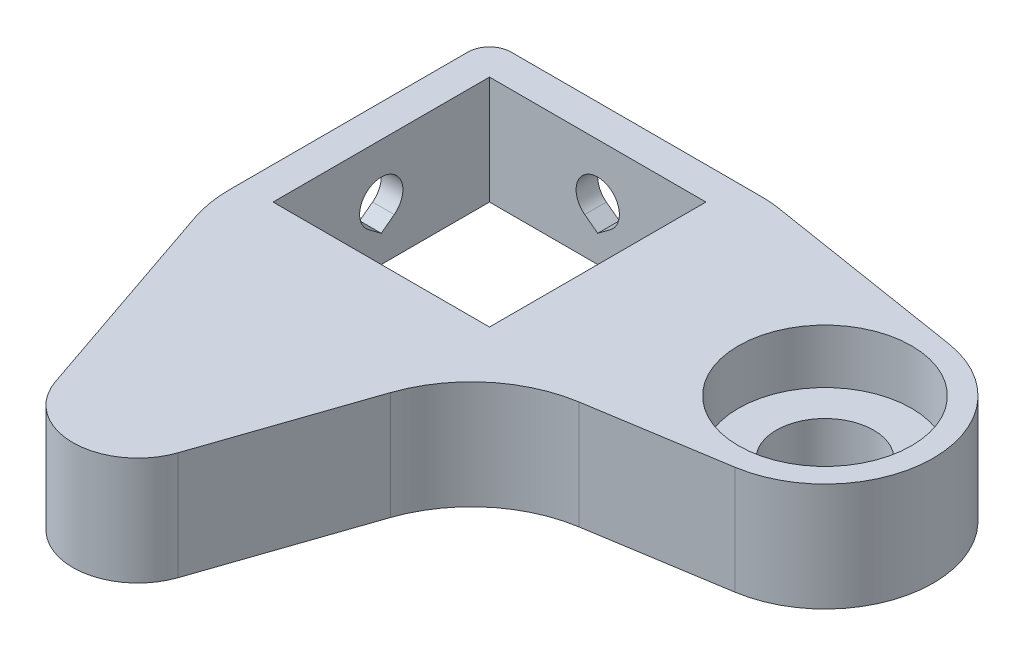
ISO-10303-21;
HEADER;
FILE_DESCRIPTION(('STEP AP214'),'2;1');
FILE_NAME('part.step','',(''),(''),'','','');
FILE_SCHEMA(('AUTOMOTIVE_DESIGN { 1 0 10303 214 1 1 1 1 }'));
ENDSEC;
DATA;
#1=APPLICATION_CONTEXT('core data for automotive mechanical design processes');
#2=APPLICATION_PROTOCOL_DEFINITION('international standard','automotive_design',2000,#1);
#3=PRODUCT_CONTEXT('',#1,'mechanical');
#4=PRODUCT('Part','Part','',(#3));
#5=PRODUCT_RELATED_PRODUCT_CATEGORY('part','',(#4));
#6=PRODUCT_DEFINITION_FORMATION('','',#4);
#7=PRODUCT_DEFINITION_CONTEXT('part definition',#1,'design');
#8=PRODUCT_DEFINITION('design','',#6,#7);
#9=PRODUCT_DEFINITION_SHAPE('','',#8);
#10=(LENGTH_UNIT() NAMED_UNIT(*) SI_UNIT(.MILLI.,.METRE.));
#11=(NAMED_UNIT(*) PLANE_ANGLE_UNIT() SI_UNIT($,.RADIAN.));
#12=(NAMED_UNIT(*) SI_UNIT($,.STERADIAN.) SOLID_ANGLE_UNIT());
#13=UNCERTAINTY_MEASURE_WITH_UNIT(LENGTH_MEASURE(1.E-05),#10,'distance_accuracy_value','');
#14=(GEOMETRIC_REPRESENTATION_CONTEXT(3) GLOBAL_UNCERTAINTY_ASSIGNED_CONTEXT((#13)) GLOBAL_UNIT_ASSIGNED_CONTEXT((#10,
#11,#12)) REPRESENTATION_CONTEXT('',''));
#15=CARTESIAN_POINT('',(0.,0.,0.));
#16=DIRECTION('',(0.,0.,1.));
#17=DIRECTION('',(1.,0.,0.));
#18=AXIS2_PLACEMENT_3D('',#15,#16,#17);
#19=CARTESIAN_POINT('',(-3.,10.,21.0073548304726));
#20=DIRECTION('',(1.,0.,0.));
#21=DIRECTION('',(0.,0.,-1.));
#22=AXIS2_PLACEMENT_3D('',#19,#20,#21);
#23=PLANE('',#22);
#24=DIRECTION('',(0.,0.,1.));
#25=VECTOR('',#24,1.);
#26=CARTESIAN_POINT('',(-3.,0.,21.0073548304726));
#27=LINE('',#26,#25);
#28=CARTESIAN_POINT('',(-3.,0.,-1.));
#29=VERTEX_POINT('',#28);
#30=CARTESIAN_POINT('',(-3.,0.,21.0073548304726));
#31=VERTEX_POINT('',#30);
#32=EDGE_CURVE('E369',#29,#31,#27,.T.);
#33=ORIENTED_EDGE('',*,*,#32,.T.);
#34=DIRECTION('',(0.,-1.,0.));
#35=VECTOR('',#34,1.);
#36=CARTESIAN_POINT('',(-3.,10.,21.0073548304726));
#37=LINE('',#36,#35);
#38=CARTESIAN_POINT('',(-3.,10.,21.0073548304726));
#39=VERTEX_POINT('',#38);
#40=EDGE_CURVE('E55',#39,#31,#37,.T.);
#41=ORIENTED_EDGE('',*,*,#40,.F.);
#42=DIRECTION('',(0.,0.,1.));
#43=VECTOR('',#42,1.);
#44=CARTESIAN_POINT('',(-3.,10.,21.0073548304726));
#45=LINE('',#44,#43);
#46=CARTESIAN_POINT('',(-3.,10.,-1.));
#47=VERTEX_POINT('',#46);
#48=EDGE_CURVE('E331',#47,#39,#45,.T.);
#49=ORIENTED_EDGE('',*,*,#48,.F.);
#50=DIRECTION('',(0.,-1.,0.));
#51=VECTOR('',#50,1.);
#52=CARTESIAN_POINT('',(-3.,10.,-1.));
#53=LINE('',#52,#51);
#54=EDGE_CURVE('E11',#47,#29,#53,.T.);
#55=ORIENTED_EDGE('',*,*,#54,.T.);
#56=EDGE_LOOP('',(#33,#41,#49,#55));
#57=FACE_BOUND('',#56,.T.);
#58=DIRECTION('',(0.,0.62853936105471,-0.777777777777777));
#59=VECTOR('',#58,1.);
#60=CARTESIAN_POINT('',(-3.,0.5,10.));
#61=LINE('',#60,#59);
#62=CARTESIAN_POINT('',(-3.,0.5,10.));
#63=VERTEX_POINT('',#62);
#64=CARTESIAN_POINT('',(-3.,2.27777777777778,7.80011223630853));
#65=VERTEX_POINT('',#64);
#66=EDGE_CURVE('E242',#63,#65,#61,.T.);
#67=ORIENTED_EDGE('',*,*,#66,.T.);
#68=CARTESIAN_POINT('',(-3.,5.,10.));
#69=DIRECTION('',(-1.,0.,0.));
#70=DIRECTION('',(0.,0.,1.));
#71=AXIS2_PLACEMENT_3D('',#68,#69,#70);
#72=CIRCLE('',#71,3.5);
#73=CARTESIAN_POINT('',(-3.,2.27777777777778,12.1998877636915));
#74=VERTEX_POINT('',#73);
#75=EDGE_CURVE('E258',#74,#65,#72,.T.);
#76=ORIENTED_EDGE('',*,*,#75,.F.);
#77=DIRECTION('',(0.,-0.628539361054708,-0.777777777777778));
#78=VECTOR('',#77,1.);
#79=CARTESIAN_POINT('',(-3.,2.27777777777778,12.1998877636915));
#80=LINE('',#79,#78);
#81=EDGE_CURVE('E63',#74,#63,#80,.T.);
#82=ORIENTED_EDGE('',*,*,#81,.T.);
#83=EDGE_LOOP('',(#67,#76,#82));
#84=FACE_BOUND('',#83,.T.);
#85=ADVANCED_FACE('F45',(#57,#84),#23,.F.);
#86=CARTESIAN_POINT('',(-3.,5.,10.));
#87=DIRECTION('',(-1.,0.,0.));
#88=DIRECTION('',(0.,0.,1.));
#89=AXIS2_PLACEMENT_3D('',#86,#87,#88);
#90=CYLINDRICAL_SURFACE('',#89,3.5);
#91=DIRECTION('',(1.,0.,0.));
#92=VECTOR('',#91,1.);
#93=CARTESIAN_POINT('',(-7.74536811201391,2.27777777777778,7.80011223630853));
#94=LINE('',#93,#92);
#95=CARTESIAN_POINT('',(-2.,2.27777777777778,7.80011223630853));
#96=VERTEX_POINT('',#95);
#97=EDGE_CURVE('E243',#65,#96,#94,.T.);
#98=ORIENTED_EDGE('',*,*,#97,.T.);
#99=CARTESIAN_POINT('',(-2.,5.,10.));
#100=DIRECTION('',(-1.,0.,0.));
#101=DIRECTION('',(0.,0.,1.));
#102=AXIS2_PLACEMENT_3D('',#99,#100,#101);
#103=CIRCLE('',#102,3.5);
#104=CARTESIAN_POINT('',(-2.,2.27777777777778,12.1998877636915));
#105=VERTEX_POINT('',#104);
#106=EDGE_CURVE('E250',#105,#96,#103,.T.);
#107=ORIENTED_EDGE('',*,*,#106,.F.);
#108=DIRECTION('',(1.,0.,0.));
#109=VECTOR('',#108,1.);
#110=CARTESIAN_POINT('',(-7.74536811201391,2.27777777777778,12.1998877636915));
#111=LINE('',#110,#109);
#112=EDGE_CURVE('E233',#74,#105,#111,.T.);
#113=ORIENTED_EDGE('',*,*,#112,.F.);
#114=ORIENTED_EDGE('',*,*,#75,.T.);
#115=EDGE_LOOP('',(#98,#107,#113,#114));
#116=FACE_BOUND('',#115,.T.);
#117=ADVANCED_FACE('F255',(#116),#90,.F.);
#118=CARTESIAN_POINT('',(-1.,10.,-3.));
#119=DIRECTION('',(0.,0.,1.));
#120=DIRECTION('',(1.,0.,0.));
#121=AXIS2_PLACEMENT_3D('',#118,#119,#120);
#122=PLANE('',#121);
#123=DIRECTION('',(-1.,0.,0.));
#124=VECTOR('',#123,1.);
#125=CARTESIAN_POINT('',(-1.,0.,-3.));
#126=LINE('',#125,#124);
#127=CARTESIAN_POINT('',(22.0482290774266,0.,-3.));
#128=VERTEX_POINT('',#127);
#129=CARTESIAN_POINT('',(-1.,0.,-3.));
#130=VERTEX_POINT('',#129);
#131=EDGE_CURVE('E332',#128,#130,#126,.T.);
#132=ORIENTED_EDGE('',*,*,#131,.T.);
#133=DIRECTION('',(0.,-1.,0.));
#134=VECTOR('',#133,1.);
#135=CARTESIAN_POINT('',(-1.,10.,-3.));
#136=LINE('',#135,#134);
#137=CARTESIAN_POINT('',(-1.,10.,-3.));
#138=VERTEX_POINT('',#137);
#139=EDGE_CURVE('E365',#138,#130,#136,.T.);
#140=ORIENTED_EDGE('',*,*,#139,.F.);
#141=DIRECTION('',(-1.,0.,0.));
#142=VECTOR('',#141,1.);
#143=CARTESIAN_POINT('',(-1.,10.,-3.));
#144=LINE('',#143,#142);
#145=CARTESIAN_POINT('',(22.0482290774266,10.,-3.));
#146=VERTEX_POINT('',#145);
#147=EDGE_CURVE('E362',#146,#138,#144,.T.);
#148=ORIENTED_EDGE('',*,*,#147,.F.);
#149=DIRECTION('',(0.,-1.,0.));
#150=VECTOR('',#149,1.);
#151=CARTESIAN_POINT('',(22.0482290774266,10.,-3.));
#152=LINE('',#151,#150);
#153=EDGE_CURVE('E404',#146,#128,#152,.T.);
#154=ORIENTED_EDGE('',*,*,#153,.T.);
#155=EDGE_LOOP('',(#132,#140,#148,#154));
#156=FACE_BOUND('',#155,.T.);
#157=DIRECTION('',(0.777777777777777,-0.62853936105471,0.));
#158=VECTOR('',#157,1.);
#159=CARTESIAN_POINT('',(10.,0.5,-3.));
#160=LINE('',#159,#158);
#161=CARTESIAN_POINT('',(7.80011223630852,2.27777777777779,-3.));
#162=VERTEX_POINT('',#161);
#163=CARTESIAN_POINT('',(10.,0.500000000000001,-3.));
#164=VERTEX_POINT('',#163);
#165=EDGE_CURVE('E486',#162,#164,#160,.T.);
#166=ORIENTED_EDGE('',*,*,#165,.T.);
#167=DIRECTION('',(0.777777777777777,0.62853936105471,0.));
#168=VECTOR('',#167,1.);
#169=CARTESIAN_POINT('',(12.1998877636915,2.27777777777778,-3.));
#170=LINE('',#169,#168);
#171=CARTESIAN_POINT('',(12.1998877636915,2.27777777777778,-3.));
#172=VERTEX_POINT('',#171);
#173=EDGE_CURVE('E490',#164,#172,#170,.T.);
#174=ORIENTED_EDGE('',*,*,#173,.T.);
#175=CARTESIAN_POINT('',(10.,5.,-3.));
#176=DIRECTION('',(0.,0.,-1.));
#177=DIRECTION('',(-1.,0.,0.));
#178=AXIS2_PLACEMENT_3D('',#175,#176,#177);
#179=CIRCLE('',#178,3.5);
#180=EDGE_CURVE('E536',#162,#172,#179,.T.);
#181=ORIENTED_EDGE('',*,*,#180,.F.);
#182=EDGE_LOOP('',(#166,#174,#181));
#183=FACE_BOUND('',#182,.T.);
#184=ADVANCED_FACE('F583',(#156,#183),#122,.F.);
#185=CARTESIAN_POINT('',(10.,5.,-3.));
#186=DIRECTION('',(0.,0.,-1.));
#187=DIRECTION('',(-1.,0.,0.));
#188=AXIS2_PLACEMENT_3D('',#185,#186,#187);
#189=CYLINDRICAL_SURFACE('',#188,3.5);
#190=DIRECTION('',(0.,0.,1.));
#191=VECTOR('',#190,1.);
#192=CARTESIAN_POINT('',(7.80011223630852,2.27777777777779,-7.74536811201392));
#193=LINE('',#192,#191);
#194=CARTESIAN_POINT('',(7.80011223630852,2.27777777777779,-2.));
#195=VERTEX_POINT('',#194);
#196=EDGE_CURVE('E507',#162,#195,#193,.T.);
#197=ORIENTED_EDGE('',*,*,#196,.F.);
#198=ORIENTED_EDGE('',*,*,#180,.T.);
#199=DIRECTION('',(0.,0.,1.));
#200=VECTOR('',#199,1.);
#201=CARTESIAN_POINT('',(12.1998877636915,2.27777777777778,-7.74536811201392));
#202=LINE('',#201,#200);
#203=CARTESIAN_POINT('',(12.1998877636915,2.27777777777778,-2.));
#204=VERTEX_POINT('',#203);
#205=EDGE_CURVE('E503',#172,#204,#202,.T.);
#206=ORIENTED_EDGE('',*,*,#205,.T.);
#207=CARTESIAN_POINT('',(10.,5.,-2.));
#208=DIRECTION('',(0.,0.,-1.));
#209=DIRECTION('',(-1.,0.,0.));
#210=AXIS2_PLACEMENT_3D('',#207,#208,#209);
#211=CIRCLE('',#210,3.5);
#212=EDGE_CURVE('E540',#195,#204,#211,.T.);
#213=ORIENTED_EDGE('',*,*,#212,.F.);
#214=EDGE_LOOP('',(#197,#198,#206,#213));
#215=FACE_BOUND('',#214,.T.);
#216=ADVANCED_FACE('F626',(#215),#189,.F.);
#217=CARTESIAN_POINT('',(-1.,10.,-1.));
#218=DIRECTION('',(0.,-1.,0.));
#219=DIRECTION('',(0.,0.,-1.));
#220=AXIS2_PLACEMENT_3D('',#217,#218,#219);
#221=PLANE('',#220);
#222=CARTESIAN_POINT('',(41.,10.,10.));
#223=DIRECTION('',(0.,-1.,0.));
#224=DIRECTION('',(0.,0.,-1.));
#225=AXIS2_PLACEMENT_3D('',#222,#223,#224);
#226=CIRCLE('',#225,8.);
#227=CARTESIAN_POINT('',(41.,10.,2.00000000000001));
#228=VERTEX_POINT('',#227);
#229=EDGE_CURVE('E281',#228,#228,#226,.F.);
#230=ORIENTED_EDGE('',*,*,#229,.F.);
#231=EDGE_LOOP('',(#230));
#232=FACE_BOUND('',#231,.T.);
#233=CARTESIAN_POINT('',(-1.,10.,-1.));
#234=DIRECTION('',(0.,1.,0.));
#235=DIRECTION('',(0.,0.,-1.));
#236=AXIS2_PLACEMENT_3D('',#233,#234,#235);
#237=CIRCLE('',#236,2.);
#238=EDGE_CURVE('E327',#138,#47,#237,.T.);
#239=ORIENTED_EDGE('',*,*,#238,.T.);
#240=ORIENTED_EDGE('',*,*,#48,.T.);
#241=CARTESIAN_POINT('',(9.,10.,21.0073548304726));
#242=DIRECTION('',(0.,1.,0.));
#243=DIRECTION('',(0.,0.,1.));
#244=AXIS2_PLACEMENT_3D('',#241,#242,#243);
#245=CIRCLE('',#244,12.);
#246=CARTESIAN_POINT('',(-2.35598549897115,10.,24.885704137479));
#247=VERTEX_POINT('',#246);
#248=EDGE_CURVE('E335',#39,#247,#245,.T.);
#249=ORIENTED_EDGE('',*,*,#248,.T.);
#250=DIRECTION('',(0.323195775583867,0.,0.946332124914262));
#251=VECTOR('',#250,1.);
#252=CARTESIAN_POINT('',(-2.35598549897114,10.,24.885704137479));
#253=LINE('',#252,#251);
#254=CARTESIAN_POINT('',(4.32200725051444,10.,44.4391746535032));
#255=VERTEX_POINT('',#254);
#256=EDGE_CURVE('E338',#247,#255,#253,.T.);
#257=ORIENTED_EDGE('',*,*,#256,.T.);
#258=CARTESIAN_POINT('',(10.,10.,42.5));
#259=DIRECTION('',(0.,1.,0.));
#260=DIRECTION('',(0.,0.,1.));
#261=AXIS2_PLACEMENT_3D('',#258,#259,#260);
#262=CIRCLE('',#261,6.);
#263=CARTESIAN_POINT('',(15.6779927494856,10.,44.4391746535032));
#264=VERTEX_POINT('',#263);
#265=EDGE_CURVE('E341',#255,#264,#262,.T.);
#266=ORIENTED_EDGE('',*,*,#265,.T.);
#267=DIRECTION('',(0.323195775583867,0.,-0.946332124914262));
#268=VECTOR('',#267,1.);
#269=CARTESIAN_POINT('',(20.6662452592514,10.,29.8333414285865));
#270=LINE('',#269,#268);
#271=CARTESIAN_POINT('',(20.6662452592514,10.,29.8333414285865));
#272=VERTEX_POINT('',#271);
#273=EDGE_CURVE('E344',#264,#272,#270,.T.);
#274=ORIENTED_EDGE('',*,*,#273,.T.);
#275=CARTESIAN_POINT('',(32.0222307582225,10.,33.711690735593));
#276=DIRECTION('',(0.,-1.,0.));
#277=DIRECTION('',(0.,0.,1.));
#278=AXIS2_PLACEMENT_3D('',#275,#276,#277);
#279=CIRCLE('',#278,12.);
#280=CARTESIAN_POINT('',(30.1305887585279,10.,21.8617248898619));
#281=VERTEX_POINT('',#280);
#282=EDGE_CURVE('E347',#272,#281,#279,.T.);
#283=ORIENTED_EDGE('',*,*,#282,.T.);
#284=DIRECTION('',(0.987497153810917,0.,-0.157636833307885));
#285=VECTOR('',#284,1.);
#286=CARTESIAN_POINT('',(30.1305887585279,10.,21.861724889862));
#287=LINE('',#286,#285);
#288=CARTESIAN_POINT('',(42.5763683330788,10.,19.8749715381092));
#289=VERTEX_POINT('',#288);
#290=EDGE_CURVE('E350',#281,#289,#287,.T.);
#291=ORIENTED_EDGE('',*,*,#290,.T.);
#292=CARTESIAN_POINT('',(41.,10.,9.99999999999999));
#293=DIRECTION('',(0.,1.,0.));
#294=DIRECTION('',(0.,0.,1.));
#295=AXIS2_PLACEMENT_3D('',#292,#293,#294);
#296=CIRCLE('',#295,10.);
#297=CARTESIAN_POINT('',(42.5763683330788,10.,0.12502846189082));
#298=VERTEX_POINT('',#297);
#299=EDGE_CURVE('E353',#289,#298,#296,.T.);
#300=ORIENTED_EDGE('',*,*,#299,.T.);
#301=DIRECTION('',(-0.987497153810917,0.,-0.157636833307885));
#302=VECTOR('',#301,1.);
#303=CARTESIAN_POINT('',(23.9398710771213,10.,-2.849965845731));
#304=LINE('',#303,#302);
#305=CARTESIAN_POINT('',(23.9398710771213,10.,-2.849965845731));
#306=VERTEX_POINT('',#305);
#307=EDGE_CURVE('E356',#298,#306,#304,.T.);
#308=ORIENTED_EDGE('',*,*,#307,.T.);
#309=CARTESIAN_POINT('',(22.0482290774266,10.,9.));
#310=DIRECTION('',(0.,1.,0.));
#311=DIRECTION('',(0.,0.,1.));
#312=AXIS2_PLACEMENT_3D('',#309,#310,#311);
#313=CIRCLE('',#312,12.);
#314=EDGE_CURVE('E359',#306,#146,#313,.T.);
#315=ORIENTED_EDGE('',*,*,#314,.T.);
#316=ORIENTED_EDGE('',*,*,#147,.T.);
#317=EDGE_LOOP('',(#239,#240,#249,#257,#266,#274,#283,#291,#300,#308,#315,#316));
#318=FACE_BOUND('',#317,.T.);
#319=DIRECTION('',(0.,0.,-1.));
#320=VECTOR('',#319,1.);
#321=CARTESIAN_POINT('',(20.,10.,20.));
#322=LINE('',#321,#320);
#323=CARTESIAN_POINT('',(20.,10.,20.));
#324=VERTEX_POINT('',#323);
#325=CARTESIAN_POINT('',(20.,10.,0.));
#326=VERTEX_POINT('',#325);
#327=EDGE_CURVE('E283',#324,#326,#322,.T.);
#328=ORIENTED_EDGE('',*,*,#327,.F.);
#329=DIRECTION('',(1.,0.,0.));
#330=VECTOR('',#329,1.);
#331=CARTESIAN_POINT('',(0.,10.,20.));
#332=LINE('',#331,#330);
#333=CARTESIAN_POINT('',(0.,10.,20.));
#334=VERTEX_POINT('',#333);
#335=EDGE_CURVE('E294',#334,#324,#332,.T.);
#336=ORIENTED_EDGE('',*,*,#335,.F.);
#337=DIRECTION('',(0.,0.,1.));
#338=VECTOR('',#337,1.);
#339=CARTESIAN_POINT('',(0.,10.,20.));
#340=LINE('',#339,#338);
#341=CARTESIAN_POINT('',(0.,10.,0.));
#342=VERTEX_POINT('',#341);
#343=EDGE_CURVE('E290',#342,#334,#340,.T.);
#344=ORIENTED_EDGE('',*,*,#343,.F.);
#345=DIRECTION('',(-1.,0.,0.));
#346=VECTOR('',#345,1.);
#347=CARTESIAN_POINT('',(0.,10.,0.));
#348=LINE('',#347,#346);
#349=EDGE_CURVE('E286',#326,#342,#348,.T.);
#350=ORIENTED_EDGE('',*,*,#349,.F.);
#351=EDGE_LOOP('',(#328,#336,#344,#350));
#352=FACE_BOUND('',#351,.T.);
#353=ADVANCED_FACE('F631',(#232,#318,#352),#221,.F.);
#354=CARTESIAN_POINT('',(-1.,0.,-1.));
#355=DIRECTION('',(0.,-1.,0.));
#356=DIRECTION('',(0.,0.,-1.));
#357=AXIS2_PLACEMENT_3D('',#354,#355,#356);
#358=PLANE('',#357);
#359=CARTESIAN_POINT('',(10.,0.,42.5));
#360=DIRECTION('',(0.,-1.,0.));
#361=DIRECTION('',(0.,0.,-1.));
#362=AXIS2_PLACEMENT_3D('',#359,#360,#361);
#363=CIRCLE('',#362,4.00000000000001);
#364=CARTESIAN_POINT('',(10.,0.,38.5));
#365=VERTEX_POINT('',#364);
#366=EDGE_CURVE('E282',#365,#365,#363,.T.);
#367=ORIENTED_EDGE('',*,*,#366,.F.);
#368=EDGE_LOOP('',(#367));
#369=FACE_BOUND('',#368,.T.);
#370=CARTESIAN_POINT('',(41.,0.,10.));
#371=DIRECTION('',(0.,-1.,0.));
#372=DIRECTION('',(0.,0.,-1.));
#373=AXIS2_PLACEMENT_3D('',#370,#371,#372);
#374=CIRCLE('',#373,4.5);
#375=CARTESIAN_POINT('',(41.,0.,5.5));
#376=VERTEX_POINT('',#375);
#377=EDGE_CURVE('E272',#376,#376,#374,.T.);
#378=ORIENTED_EDGE('',*,*,#377,.F.);
#379=EDGE_LOOP('',(#378));
#380=FACE_BOUND('',#379,.T.);
#381=CARTESIAN_POINT('',(-1.,0.,-1.));
#382=DIRECTION('',(0.,1.,0.));
#383=DIRECTION('',(0.,0.,-1.));
#384=AXIS2_PLACEMENT_3D('',#381,#382,#383);
#385=CIRCLE('',#384,2.);
#386=EDGE_CURVE('E326',#130,#29,#385,.T.);
#387=ORIENTED_EDGE('',*,*,#386,.F.);
#388=ORIENTED_EDGE('',*,*,#131,.F.);
#389=CARTESIAN_POINT('',(22.0482290774266,0.,9.));
#390=DIRECTION('',(0.,1.,0.));
#391=DIRECTION('',(0.,0.,1.));
#392=AXIS2_PLACEMENT_3D('',#389,#390,#391);
#393=CIRCLE('',#392,12.);
#394=CARTESIAN_POINT('',(23.9398710771213,0.,-2.849965845731));
#395=VERTEX_POINT('',#394);
#396=EDGE_CURVE('E396',#395,#128,#393,.T.);
#397=ORIENTED_EDGE('',*,*,#396,.F.);
#398=DIRECTION('',(-0.987497153810917,0.,-0.157636833307885));
#399=VECTOR('',#398,1.);
#400=CARTESIAN_POINT('',(23.9398710771213,0.,-2.849965845731));
#401=LINE('',#400,#399);
#402=CARTESIAN_POINT('',(42.5763683330788,0.,0.12502846189082));
#403=VERTEX_POINT('',#402);
#404=EDGE_CURVE('E393',#403,#395,#401,.T.);
#405=ORIENTED_EDGE('',*,*,#404,.F.);
#406=CARTESIAN_POINT('',(41.,0.,9.99999999999999));
#407=DIRECTION('',(0.,1.,0.));
#408=DIRECTION('',(0.,0.,1.));
#409=AXIS2_PLACEMENT_3D('',#406,#407,#408);
#410=CIRCLE('',#409,10.);
#411=CARTESIAN_POINT('',(42.5763683330788,0.,19.8749715381092));
#412=VERTEX_POINT('',#411);
#413=EDGE_CURVE('E390',#412,#403,#410,.T.);
#414=ORIENTED_EDGE('',*,*,#413,.F.);
#415=DIRECTION('',(0.987497153810917,0.,-0.157636833307885));
#416=VECTOR('',#415,1.);
#417=CARTESIAN_POINT('',(30.1305887585279,0.,21.861724889862));
#418=LINE('',#417,#416);
#419=CARTESIAN_POINT('',(30.1305887585279,0.,21.8617248898619));
#420=VERTEX_POINT('',#419);
#421=EDGE_CURVE('E387',#420,#412,#418,.T.);
#422=ORIENTED_EDGE('',*,*,#421,.F.);
#423=CARTESIAN_POINT('',(32.0222307582225,0.,33.711690735593));
#424=DIRECTION('',(0.,-1.,0.));
#425=DIRECTION('',(0.,0.,1.));
#426=AXIS2_PLACEMENT_3D('',#423,#424,#425);
#427=CIRCLE('',#426,12.);
#428=CARTESIAN_POINT('',(20.6662452592514,0.,29.8333414285865));
#429=VERTEX_POINT('',#428);
#430=EDGE_CURVE('E384',#429,#420,#427,.T.);
#431=ORIENTED_EDGE('',*,*,#430,.F.);
#432=DIRECTION('',(0.323195775583867,0.,-0.946332124914262));
#433=VECTOR('',#432,1.);
#434=CARTESIAN_POINT('',(20.6662452592514,0.,29.8333414285865));
#435=LINE('',#434,#433);
#436=CARTESIAN_POINT('',(15.6779927494856,0.,44.4391746535032));
#437=VERTEX_POINT('',#436);
#438=EDGE_CURVE('E381',#437,#429,#435,.T.);
#439=ORIENTED_EDGE('',*,*,#438,.F.);
#440=CARTESIAN_POINT('',(10.,0.,42.5));
#441=DIRECTION('',(0.,1.,0.));
#442=DIRECTION('',(0.,0.,1.));
#443=AXIS2_PLACEMENT_3D('',#440,#441,#442);
#444=CIRCLE('',#443,6.);
#445=CARTESIAN_POINT('',(4.32200725051444,0.,44.4391746535032));
#446=VERTEX_POINT('',#445);
#447=EDGE_CURVE('E378',#446,#437,#444,.T.);
#448=ORIENTED_EDGE('',*,*,#447,.F.);
#449=DIRECTION('',(0.323195775583867,0.,0.946332124914262));
#450=VECTOR('',#449,1.);
#451=CARTESIAN_POINT('',(-2.35598549897114,0.,24.885704137479));
#452=LINE('',#451,#450);
#453=CARTESIAN_POINT('',(-2.35598549897115,0.,24.885704137479));
#454=VERTEX_POINT('',#453);
#455=EDGE_CURVE('E375',#454,#446,#452,.T.);
#456=ORIENTED_EDGE('',*,*,#455,.F.);
#457=CARTESIAN_POINT('',(9.,0.,21.0073548304726));
#458=DIRECTION('',(0.,1.,0.));
#459=DIRECTION('',(0.,0.,1.));
#460=AXIS2_PLACEMENT_3D('',#457,#458,#459);
#461=CIRCLE('',#460,12.);
#462=EDGE_CURVE('E372',#31,#454,#461,.T.);
#463=ORIENTED_EDGE('',*,*,#462,.F.);
#464=ORIENTED_EDGE('',*,*,#32,.F.);
#465=EDGE_LOOP('',(#387,#388,#397,#405,#414,#422,#431,#439,#448,#456,#463,#464));
#466=FACE_BOUND('',#465,.T.);
#467=DIRECTION('',(1.,0.,0.));
#468=VECTOR('',#467,1.);
#469=CARTESIAN_POINT('',(0.,0.,20.));
#470=LINE('',#469,#468);
#471=CARTESIAN_POINT('',(0.,0.,20.));
#472=VERTEX_POINT('',#471);
#473=CARTESIAN_POINT('',(20.,0.,20.));
#474=VERTEX_POINT('',#473);
#475=EDGE_CURVE('E287',#472,#474,#470,.T.);
#476=ORIENTED_EDGE('',*,*,#475,.T.);
#477=DIRECTION('',(0.,0.,-1.));
#478=VECTOR('',#477,1.);
#479=CARTESIAN_POINT('',(20.,0.,20.));
#480=LINE('',#479,#478);
#481=CARTESIAN_POINT('',(20.,0.,0.));
#482=VERTEX_POINT('',#481);
#483=EDGE_CURVE('E298',#474,#482,#480,.T.);
#484=ORIENTED_EDGE('',*,*,#483,.T.);
#485=DIRECTION('',(-1.,0.,0.));
#486=VECTOR('',#485,1.);
#487=CARTESIAN_POINT('',(0.,0.,0.));
#488=LINE('',#487,#486);
#489=CARTESIAN_POINT('',(0.,0.,0.));
#490=VERTEX_POINT('',#489);
#491=EDGE_CURVE('E302',#482,#490,#488,.T.);
#492=ORIENTED_EDGE('',*,*,#491,.T.);
#493=DIRECTION('',(0.,0.,1.));
#494=VECTOR('',#493,1.);
#495=CARTESIAN_POINT('',(0.,0.,20.));
#496=LINE('',#495,#494);
#497=EDGE_CURVE('E306',#490,#472,#496,.T.);
#498=ORIENTED_EDGE('',*,*,#497,.T.);
#499=EDGE_LOOP('',(#476,#484,#492,#498));
#500=FACE_BOUND('',#499,.T.);
#501=ADVANCED_FACE('F628',(#369,#380,#466,#500),#358,.T.);
#502=CARTESIAN_POINT('',(-1.,10.,-1.));
#503=DIRECTION('',(0.,-1.,0.));
#504=DIRECTION('',(0.,0.,-1.));
#505=AXIS2_PLACEMENT_3D('',#502,#503,#504);
#506=CYLINDRICAL_SURFACE('',#505,2.);
#507=ORIENTED_EDGE('',*,*,#386,.T.);
#508=ORIENTED_EDGE('',*,*,#54,.F.);
#509=ORIENTED_EDGE('',*,*,#238,.F.);
#510=ORIENTED_EDGE('',*,*,#139,.T.);
#511=EDGE_LOOP('',(#507,#508,#509,#510));
#512=FACE_BOUND('',#511,.T.);
#513=ADVANCED_FACE('F47',(#512),#506,.T.);
#514=CARTESIAN_POINT('',(9.,10.,21.0073548304726));
#515=DIRECTION('',(0.,-1.,0.));
#516=DIRECTION('',(0.,0.,-1.));
#517=AXIS2_PLACEMENT_3D('',#514,#515,#516);
#518=CYLINDRICAL_SURFACE('',#517,12.);
#519=ORIENTED_EDGE('',*,*,#462,.T.);
#520=DIRECTION('',(0.,-1.,0.));
#521=VECTOR('',#520,1.);
#522=CARTESIAN_POINT('',(-2.35598549897115,10.,24.885704137479));
#523=LINE('',#522,#521);
#524=EDGE_CURVE('E436',#247,#454,#523,.T.);
#525=ORIENTED_EDGE('',*,*,#524,.F.);
#526=ORIENTED_EDGE('',*,*,#248,.F.);
#527=ORIENTED_EDGE('',*,*,#40,.T.);
#528=EDGE_LOOP('',(#519,#525,#526,#527));
#529=FACE_BOUND('',#528,.T.);
#530=ADVANCED_FACE('F587',(#529),#518,.T.);
#531=CARTESIAN_POINT('',(-2.35598549897114,10.,24.885704137479));
#532=DIRECTION('',(0.946332124914262,0.,-0.323195775583867));
#533=DIRECTION('',(-0.323195775583867,0.,-0.946332124914262));
#534=AXIS2_PLACEMENT_3D('',#531,#532,#533);
#535=PLANE('',#534);
#536=ORIENTED_EDGE('',*,*,#455,.T.);
#537=DIRECTION('',(0.,-1.,0.));
#538=VECTOR('',#537,1.);
#539=CARTESIAN_POINT('',(4.32200725051444,10.,44.4391746535032));
#540=LINE('',#539,#538);
#541=EDGE_CURVE('E432',#255,#446,#540,.T.);
#542=ORIENTED_EDGE('',*,*,#541,.F.);
#543=ORIENTED_EDGE('',*,*,#256,.F.);
#544=ORIENTED_EDGE('',*,*,#524,.T.);
#545=EDGE_LOOP('',(#536,#542,#543,#544));
#546=FACE_BOUND('',#545,.T.);
#547=ADVANCED_FACE('F590',(#546),#535,.F.);
#548=CARTESIAN_POINT('',(10.,10.,42.5));
#549=DIRECTION('',(0.,-1.,0.));
#550=DIRECTION('',(0.,0.,-1.));
#551=AXIS2_PLACEMENT_3D('',#548,#549,#550);
#552=CYLINDRICAL_SURFACE('',#551,6.);
#553=ORIENTED_EDGE('',*,*,#447,.T.);
#554=DIRECTION('',(0.,-1.,0.));
#555=VECTOR('',#554,1.);
#556=CARTESIAN_POINT('',(15.6779927494856,10.,44.4391746535032));
#557=LINE('',#556,#555);
#558=EDGE_CURVE('E428',#264,#437,#557,.T.);
#559=ORIENTED_EDGE('',*,*,#558,.F.);
#560=ORIENTED_EDGE('',*,*,#265,.F.);
#561=ORIENTED_EDGE('',*,*,#541,.T.);
#562=EDGE_LOOP('',(#553,#559,#560,#561));
#563=FACE_BOUND('',#562,.T.);
#564=ADVANCED_FACE('F594',(#563),#552,.T.);
#565=CARTESIAN_POINT('',(20.6662452592514,10.,29.8333414285865));
#566=DIRECTION('',(-0.946332124914262,0.,-0.323195775583867));
#567=DIRECTION('',(-0.323195775583867,0.,0.946332124914262));
#568=AXIS2_PLACEMENT_3D('',#565,#566,#567);
#569=PLANE('',#568);
#570=ORIENTED_EDGE('',*,*,#438,.T.);
#571=DIRECTION('',(0.,-1.,0.));
#572=VECTOR('',#571,1.);
#573=CARTESIAN_POINT('',(20.6662452592514,10.,29.8333414285865));
#574=LINE('',#573,#572);
#575=EDGE_CURVE('E424',#272,#429,#574,.T.);
#576=ORIENTED_EDGE('',*,*,#575,.F.);
#577=ORIENTED_EDGE('',*,*,#273,.F.);
#578=ORIENTED_EDGE('',*,*,#558,.T.);
#579=EDGE_LOOP('',(#570,#576,#577,#578));
#580=FACE_BOUND('',#579,.T.);
#581=ADVANCED_FACE('F598',(#580),#569,.F.);
#582=CARTESIAN_POINT('',(32.0222307582225,10.,33.711690735593));
#583=DIRECTION('',(0.,-1.,0.));
#584=DIRECTION('',(0.,0.,-1.));
#585=AXIS2_PLACEMENT_3D('',#582,#583,#584);
#586=CYLINDRICAL_SURFACE('',#585,12.);
#587=ORIENTED_EDGE('',*,*,#430,.T.);
#588=DIRECTION('',(0.,-1.,0.));
#589=VECTOR('',#588,1.);
#590=CARTESIAN_POINT('',(30.1305887585279,10.,21.8617248898619));
#591=LINE('',#590,#589);
#592=EDGE_CURVE('E420',#281,#420,#591,.T.);
#593=ORIENTED_EDGE('',*,*,#592,.F.);
#594=ORIENTED_EDGE('',*,*,#282,.F.);
#595=ORIENTED_EDGE('',*,*,#575,.T.);
#596=EDGE_LOOP('',(#587,#593,#594,#595));
#597=FACE_BOUND('',#596,.T.);
#598=ADVANCED_FACE('F602',(#597),#586,.F.);
#599=CARTESIAN_POINT('',(30.1305887585279,10.,21.861724889862));
#600=DIRECTION('',(-0.157636833307885,0.,-0.987497153810917));
#601=DIRECTION('',(-0.987497153810917,0.,0.157636833307885));
#602=AXIS2_PLACEMENT_3D('',#599,#600,#601);
#603=PLANE('',#602);
#604=ORIENTED_EDGE('',*,*,#421,.T.);
#605=DIRECTION('',(0.,-1.,0.));
#606=VECTOR('',#605,1.);
#607=CARTESIAN_POINT('',(42.5763683330788,10.,19.8749715381092));
#608=LINE('',#607,#606);
#609=EDGE_CURVE('E416',#289,#412,#608,.T.);
#610=ORIENTED_EDGE('',*,*,#609,.F.);
#611=ORIENTED_EDGE('',*,*,#290,.F.);
#612=ORIENTED_EDGE('',*,*,#592,.T.);
#613=EDGE_LOOP('',(#604,#610,#611,#612));
#614=FACE_BOUND('',#613,.T.);
#615=ADVANCED_FACE('F606',(#614),#603,.F.);
#616=CARTESIAN_POINT('',(41.,10.,9.99999999999999));
#617=DIRECTION('',(0.,-1.,0.));
#618=DIRECTION('',(0.,0.,-1.));
#619=AXIS2_PLACEMENT_3D('',#616,#617,#618);
#620=CYLINDRICAL_SURFACE('',#619,10.);
#621=ORIENTED_EDGE('',*,*,#413,.T.);
#622=DIRECTION('',(0.,-1.,0.));
#623=VECTOR('',#622,1.);
#624=CARTESIAN_POINT('',(42.5763683330788,10.,0.12502846189082));
#625=LINE('',#624,#623);
#626=EDGE_CURVE('E412',#298,#403,#625,.T.);
#627=ORIENTED_EDGE('',*,*,#626,.F.);
#628=ORIENTED_EDGE('',*,*,#299,.F.);
#629=ORIENTED_EDGE('',*,*,#609,.T.);
#630=EDGE_LOOP('',(#621,#627,#628,#629));
#631=FACE_BOUND('',#630,.T.);
#632=ADVANCED_FACE('F610',(#631),#620,.T.);
#633=CARTESIAN_POINT('',(23.9398710771213,10.,-2.849965845731));
#634=DIRECTION('',(-0.157636833307885,0.,0.987497153810917));
#635=DIRECTION('',(0.987497153810917,0.,0.157636833307885));
#636=AXIS2_PLACEMENT_3D('',#633,#634,#635);
#637=PLANE('',#636);
#638=ORIENTED_EDGE('',*,*,#404,.T.);
#639=DIRECTION('',(0.,-1.,0.));
#640=VECTOR('',#639,1.);
#641=CARTESIAN_POINT('',(23.9398710771213,10.,-2.849965845731));
#642=LINE('',#641,#640);
#643=EDGE_CURVE('E408',#306,#395,#642,.T.);
#644=ORIENTED_EDGE('',*,*,#643,.F.);
#645=ORIENTED_EDGE('',*,*,#307,.F.);
#646=ORIENTED_EDGE('',*,*,#626,.T.);
#647=EDGE_LOOP('',(#638,#644,#645,#646));
#648=FACE_BOUND('',#647,.T.);
#649=ADVANCED_FACE('F614',(#648),#637,.F.);
#650=CARTESIAN_POINT('',(22.0482290774266,10.,9.));
#651=DIRECTION('',(0.,-1.,0.));
#652=DIRECTION('',(0.,0.,-1.));
#653=AXIS2_PLACEMENT_3D('',#650,#651,#652);
#654=CYLINDRICAL_SURFACE('',#653,12.);
#655=ORIENTED_EDGE('',*,*,#396,.T.);
#656=ORIENTED_EDGE('',*,*,#153,.F.);
#657=ORIENTED_EDGE('',*,*,#314,.F.);
#658=ORIENTED_EDGE('',*,*,#643,.T.);
#659=EDGE_LOOP('',(#655,#656,#657,#658));
#660=FACE_BOUND('',#659,.T.);
#661=ADVANCED_FACE('F618',(#660),#654,.T.);
#662=CARTESIAN_POINT('',(20.,10.,20.));
#663=DIRECTION('',(-1.,0.,0.));
#664=DIRECTION('',(0.,0.,1.));
#665=AXIS2_PLACEMENT_3D('',#662,#663,#664);
#666=PLANE('',#665);
#667=ORIENTED_EDGE('',*,*,#483,.F.);
#668=DIRECTION('',(0.,-1.,0.));
#669=VECTOR('',#668,1.);
#670=CARTESIAN_POINT('',(20.,10.,20.));
#671=LINE('',#670,#669);
#672=EDGE_CURVE('E297',#324,#474,#671,.T.);
#673=ORIENTED_EDGE('',*,*,#672,.F.);
#674=ORIENTED_EDGE('',*,*,#327,.T.);
#675=DIRECTION('',(0.,-1.,0.));
#676=VECTOR('',#675,1.);
#677=CARTESIAN_POINT('',(20.,10.,0.));
#678=LINE('',#677,#676);
#679=EDGE_CURVE('E322',#326,#482,#678,.T.);
#680=ORIENTED_EDGE('',*,*,#679,.T.);
#681=EDGE_LOOP('',(#667,#673,#674,#680));
#682=FACE_BOUND('',#681,.T.);
#683=ADVANCED_FACE('F622',(#682),#666,.T.);
#684=CARTESIAN_POINT('',(0.,10.,0.));
#685=DIRECTION('',(0.,0.,1.));
#686=DIRECTION('',(1.,0.,0.));
#687=AXIS2_PLACEMENT_3D('',#684,#685,#686);
#688=PLANE('',#687);
#689=DIRECTION('',(-0.8,0.6,0.));
#690=VECTOR('',#689,1.);
#691=CARTESIAN_POINT('',(10.,2.5,0.));
#692=LINE('',#691,#690);
#693=CARTESIAN_POINT('',(10.,2.5,0.));
#694=VERTEX_POINT('',#693);
#695=CARTESIAN_POINT('',(8.8,3.4,0.));
#696=VERTEX_POINT('',#695);
#697=EDGE_CURVE('E515',#694,#696,#692,.T.);
#698=ORIENTED_EDGE('',*,*,#697,.T.);
#699=CARTESIAN_POINT('',(10.,5.,0.));
#700=DIRECTION('',(0.,0.,1.));
#701=DIRECTION('',(1.,0.,0.));
#702=AXIS2_PLACEMENT_3D('',#699,#700,#701);
#703=CIRCLE('',#702,2.);
#704=CARTESIAN_POINT('',(11.2,3.4,0.));
#705=VERTEX_POINT('',#704);
#706=EDGE_CURVE('E49',#705,#696,#703,.T.);
#707=ORIENTED_EDGE('',*,*,#706,.F.);
#708=DIRECTION('',(-0.8,-0.6,0.));
#709=VECTOR('',#708,1.);
#710=CARTESIAN_POINT('',(11.2,3.4,0.));
#711=LINE('',#710,#709);
#712=EDGE_CURVE('E523',#705,#694,#711,.T.);
#713=ORIENTED_EDGE('',*,*,#712,.T.);
#714=EDGE_LOOP('',(#698,#707,#713));
#715=FACE_BOUND('',#714,.T.);
#716=ORIENTED_EDGE('',*,*,#491,.F.);
#717=ORIENTED_EDGE('',*,*,#679,.F.);
#718=ORIENTED_EDGE('',*,*,#349,.T.);
#719=DIRECTION('',(0.,-1.,0.));
#720=VECTOR('',#719,1.);
#721=CARTESIAN_POINT('',(0.,10.,0.));
#722=LINE('',#721,#720);
#723=EDGE_CURVE('E319',#342,#490,#722,.T.);
#724=ORIENTED_EDGE('',*,*,#723,.T.);
#725=EDGE_LOOP('',(#716,#717,#718,#724));
#726=FACE_BOUND('',#725,.T.);
#727=ADVANCED_FACE('F554',(#715,#726),#688,.T.);
#728=CARTESIAN_POINT('',(0.,10.,20.));
#729=DIRECTION('',(1.,0.,0.));
#730=DIRECTION('',(0.,0.,-1.));
#731=AXIS2_PLACEMENT_3D('',#728,#729,#730);
#732=PLANE('',#731);
#733=DIRECTION('',(0.,0.6,0.8));
#734=VECTOR('',#733,1.);
#735=CARTESIAN_POINT('',(0.,2.5,10.));
#736=LINE('',#735,#734);
#737=CARTESIAN_POINT('',(0.,2.5,10.));
#738=VERTEX_POINT('',#737);
#739=CARTESIAN_POINT('',(0.,3.4,11.2));
#740=VERTEX_POINT('',#739);
#741=EDGE_CURVE('E465',#738,#740,#736,.T.);
#742=ORIENTED_EDGE('',*,*,#741,.T.);
#743=CARTESIAN_POINT('',(0.,5.,10.));
#744=DIRECTION('',(1.,0.,0.));
#745=DIRECTION('',(0.,0.,-1.));
#746=AXIS2_PLACEMENT_3D('',#743,#744,#745);
#747=CIRCLE('',#746,2.);
#748=CARTESIAN_POINT('',(0.,3.4,8.8));
#749=VERTEX_POINT('',#748);
#750=EDGE_CURVE('E263',#749,#740,#747,.T.);
#751=ORIENTED_EDGE('',*,*,#750,.F.);
#752=DIRECTION('',(0.,-0.600000000000002,0.799999999999999));
#753=VECTOR('',#752,1.);
#754=CARTESIAN_POINT('',(0.,3.4,8.8));
#755=LINE('',#754,#753);
#756=EDGE_CURVE('E464',#749,#738,#755,.T.);
#757=ORIENTED_EDGE('',*,*,#756,.T.);
#758=EDGE_LOOP('',(#742,#751,#757));
#759=FACE_BOUND('',#758,.T.);
#760=ORIENTED_EDGE('',*,*,#497,.F.);
#761=ORIENTED_EDGE('',*,*,#723,.F.);
#762=ORIENTED_EDGE('',*,*,#343,.T.);
#763=DIRECTION('',(0.,-1.,0.));
#764=VECTOR('',#763,1.);
#765=CARTESIAN_POINT('',(0.,10.,20.));
#766=LINE('',#765,#764);
#767=EDGE_CURVE('E316',#334,#472,#766,.T.);
#768=ORIENTED_EDGE('',*,*,#767,.T.);
#769=EDGE_LOOP('',(#760,#761,#762,#768));
#770=FACE_BOUND('',#769,.T.);
#771=ADVANCED_FACE('F462',(#759,#770),#732,.T.);
#772=CARTESIAN_POINT('',(0.,10.,20.));
#773=DIRECTION('',(0.,0.,-1.));
#774=DIRECTION('',(-1.,0.,0.));
#775=AXIS2_PLACEMENT_3D('',#772,#773,#774);
#776=PLANE('',#775);
#777=ORIENTED_EDGE('',*,*,#475,.F.);
#778=ORIENTED_EDGE('',*,*,#767,.F.);
#779=ORIENTED_EDGE('',*,*,#335,.T.);
#780=ORIENTED_EDGE('',*,*,#672,.T.);
#781=EDGE_LOOP('',(#777,#778,#779,#780));
#782=FACE_BOUND('',#781,.T.);
#783=ADVANCED_FACE('F643',(#782),#776,.T.);
#784=CARTESIAN_POINT('',(41.,51.,10.));
#785=DIRECTION('',(0.,-1.,0.));
#786=DIRECTION('',(0.,0.,-1.));
#787=AXIS2_PLACEMENT_3D('',#784,#785,#786);
#788=CYLINDRICAL_SURFACE('',#787,8.);
#789=CARTESIAN_POINT('',(41.,5.,10.));
#790=DIRECTION('',(0.,1.,0.));
#791=DIRECTION('',(0.,0.,1.));
#792=AXIS2_PLACEMENT_3D('',#789,#790,#791);
#793=CIRCLE('',#792,8.);
#794=CARTESIAN_POINT('',(41.,5.,18.));
#795=VERTEX_POINT('',#794);
#796=EDGE_CURVE('E277',#795,#795,#793,.T.);
#797=ORIENTED_EDGE('',*,*,#796,.F.);
#798=EDGE_LOOP('',(#797));
#799=FACE_BOUND('',#798,.T.);
#800=ORIENTED_EDGE('',*,*,#229,.T.);
#801=EDGE_LOOP('',(#800));
#802=FACE_BOUND('',#801,.T.);
#803=ADVANCED_FACE('F646',(#799,#802),#788,.F.);
#804=CARTESIAN_POINT('',(41.,5.,10.));
#805=DIRECTION('',(0.,1.,0.));
#806=DIRECTION('',(0.,0.,1.));
#807=AXIS2_PLACEMENT_3D('',#804,#805,#806);
#808=PLANE('',#807);
#809=CARTESIAN_POINT('',(41.,5.,10.));
#810=DIRECTION('',(0.,1.,0.));
#811=DIRECTION('',(0.,0.,-1.));
#812=AXIS2_PLACEMENT_3D('',#809,#810,#811);
#813=CIRCLE('',#812,4.5);
#814=CARTESIAN_POINT('',(41.,5.,5.5));
#815=VERTEX_POINT('',#814);
#816=EDGE_CURVE('E273',#815,#815,#813,.T.);
#817=ORIENTED_EDGE('',*,*,#816,.F.);
#818=EDGE_LOOP('',(#817));
#819=FACE_BOUND('',#818,.T.);
#820=ORIENTED_EDGE('',*,*,#796,.T.);
#821=EDGE_LOOP('',(#820));
#822=FACE_BOUND('',#821,.T.);
#823=ADVANCED_FACE('F650',(#819,#822),#808,.T.);
#824=CARTESIAN_POINT('',(41.,-5.,10.));
#825=DIRECTION('',(0.,1.,0.));
#826=DIRECTION('',(0.,0.,1.));
#827=AXIS2_PLACEMENT_3D('',#824,#825,#826);
#828=CYLINDRICAL_SURFACE('',#827,4.5);
#829=ORIENTED_EDGE('',*,*,#377,.T.);
#830=EDGE_LOOP('',(#829));
#831=FACE_BOUND('',#830,.T.);
#832=ORIENTED_EDGE('',*,*,#816,.T.);
#833=EDGE_LOOP('',(#832));
#834=FACE_BOUND('',#833,.T.);
#835=ADVANCED_FACE('F654',(#831,#834),#828,.F.);
#836=CARTESIAN_POINT('',(10.,-5.,42.5));
#837=DIRECTION('',(0.,1.,0.));
#838=DIRECTION('',(0.,0.,1.));
#839=AXIS2_PLACEMENT_3D('',#836,#837,#838);
#840=CYLINDRICAL_SURFACE('',#839,4.00000000000001);
#841=ORIENTED_EDGE('',*,*,#366,.T.);
#842=EDGE_LOOP('',(#841));
#843=FACE_BOUND('',#842,.T.);
#844=CARTESIAN_POINT('',(10.,5.,42.5));
#845=DIRECTION('',(0.,1.,0.));
#846=DIRECTION('',(0.,0.,-1.));
#847=AXIS2_PLACEMENT_3D('',#844,#845,#846);
#848=CIRCLE('',#847,4.00000000000001);
#849=CARTESIAN_POINT('',(10.,5.,38.5));
#850=VERTEX_POINT('',#849);
#851=EDGE_CURVE('E268',#850,#850,#848,.T.);
#852=ORIENTED_EDGE('',*,*,#851,.T.);
#853=EDGE_LOOP('',(#852));
#854=FACE_BOUND('',#853,.T.);
#855=ADVANCED_FACE('F658',(#843,#854),#840,.F.);
#856=CARTESIAN_POINT('',(10.,5.,42.5));
#857=DIRECTION('',(0.,-1.,0.));
#858=DIRECTION('',(0.,0.,-1.));
#859=AXIS2_PLACEMENT_3D('',#856,#857,#858);
#860=PLANE('',#859);
#861=ORIENTED_EDGE('',*,*,#851,.F.);
#862=EDGE_LOOP('',(#861));
#863=FACE_BOUND('',#862,.T.);
#864=ADVANCED_FACE('F662',(#863),#860,.T.);
#865=CARTESIAN_POINT('',(-3.,5.,10.));
#866=DIRECTION('',(-1.,0.,0.));
#867=DIRECTION('',(0.,0.,1.));
#868=AXIS2_PLACEMENT_3D('',#865,#866,#867);
#869=CYLINDRICAL_SURFACE('',#868,2.);
#870=ORIENTED_EDGE('',*,*,#750,.T.);
#871=DIRECTION('',(-1.,0.,0.));
#872=VECTOR('',#871,1.);
#873=CARTESIAN_POINT('',(2.56320112359526,3.4,11.2));
#874=LINE('',#873,#872);
#875=CARTESIAN_POINT('',(-2.,3.4,11.2));
#876=VERTEX_POINT('',#875);
#877=EDGE_CURVE('E457',#740,#876,#874,.T.);
#878=ORIENTED_EDGE('',*,*,#877,.T.);
#879=CARTESIAN_POINT('',(-2.,5.,10.));
#880=DIRECTION('',(-1.,0.,0.));
#881=DIRECTION('',(0.,0.,1.));
#882=AXIS2_PLACEMENT_3D('',#879,#880,#881);
#883=CIRCLE('',#882,2.);
#884=CARTESIAN_POINT('',(-2.,3.4,8.8));
#885=VERTEX_POINT('',#884);
#886=EDGE_CURVE('E257',#876,#885,#883,.T.);
#887=ORIENTED_EDGE('',*,*,#886,.T.);
#888=DIRECTION('',(-1.,0.,0.));
#889=VECTOR('',#888,1.);
#890=CARTESIAN_POINT('',(2.56320112359526,3.4,8.8));
#891=LINE('',#890,#889);
#892=EDGE_CURVE('E71',#749,#885,#891,.T.);
#893=ORIENTED_EDGE('',*,*,#892,.F.);
#894=EDGE_LOOP('',(#870,#878,#887,#893));
#895=FACE_BOUND('',#894,.T.);
#896=ADVANCED_FACE('F456',(#895),#869,.F.);
#897=CARTESIAN_POINT('',(-2.,7.,10.));
#898=DIRECTION('',(1.,0.,0.));
#899=DIRECTION('',(0.,0.,-1.));
#900=AXIS2_PLACEMENT_3D('',#897,#898,#899);
#901=PLANE('',#900);
#902=DIRECTION('',(0.,0.628539361054708,0.777777777777778));
#903=VECTOR('',#902,1.);
#904=CARTESIAN_POINT('',(-2.,2.27777777777778,12.1998877636915));
#905=LINE('',#904,#903);
#906=CARTESIAN_POINT('',(-2.,0.5,10.));
#907=VERTEX_POINT('',#906);
#908=EDGE_CURVE('E236',#907,#105,#905,.T.);
#909=ORIENTED_EDGE('',*,*,#908,.T.);
#910=ORIENTED_EDGE('',*,*,#106,.T.);
#911=DIRECTION('',(0.,-0.62853936105471,0.777777777777777));
#912=VECTOR('',#911,1.);
#913=CARTESIAN_POINT('',(-2.,0.5,10.));
#914=LINE('',#913,#912);
#915=EDGE_CURVE('E251',#96,#907,#914,.T.);
#916=ORIENTED_EDGE('',*,*,#915,.T.);
#917=EDGE_LOOP('',(#909,#910,#916));
#918=FACE_BOUND('',#917,.T.);
#919=ORIENTED_EDGE('',*,*,#886,.F.);
#920=DIRECTION('',(0.,0.6,0.8));
#921=VECTOR('',#920,1.);
#922=CARTESIAN_POINT('',(-2.,2.5,10.));
#923=LINE('',#922,#921);
#924=CARTESIAN_POINT('',(-2.,2.5,10.));
#925=VERTEX_POINT('',#924);
#926=EDGE_CURVE('E469',#925,#876,#923,.T.);
#927=ORIENTED_EDGE('',*,*,#926,.F.);
#928=DIRECTION('',(0.,-0.600000000000001,0.799999999999999));
#929=VECTOR('',#928,1.);
#930=CARTESIAN_POINT('',(-2.,3.4,8.8));
#931=LINE('',#930,#929);
#932=EDGE_CURVE('E474',#885,#925,#931,.T.);
#933=ORIENTED_EDGE('',*,*,#932,.F.);
#934=EDGE_LOOP('',(#919,#927,#933));
#935=FACE_BOUND('',#934,.T.);
#936=ADVANCED_FACE('F248',(#918,#935),#901,.F.);
#937=CARTESIAN_POINT('',(10.,5.,-3.));
#938=DIRECTION('',(0.,0.,-1.));
#939=DIRECTION('',(-1.,0.,0.));
#940=AXIS2_PLACEMENT_3D('',#937,#938,#939);
#941=CYLINDRICAL_SURFACE('',#940,2.);
#942=ORIENTED_EDGE('',*,*,#706,.T.);
#943=DIRECTION('',(0.,0.,-1.));
#944=VECTOR('',#943,1.);
#945=CARTESIAN_POINT('',(8.8,3.4,2.56320112359526));
#946=LINE('',#945,#944);
#947=CARTESIAN_POINT('',(8.8,3.4,-2.));
#948=VERTEX_POINT('',#947);
#949=EDGE_CURVE('E522',#696,#948,#946,.T.);
#950=ORIENTED_EDGE('',*,*,#949,.T.);
#951=CARTESIAN_POINT('',(10.,5.,-2.));
#952=DIRECTION('',(0.,0.,-1.));
#953=DIRECTION('',(-1.,0.,0.));
#954=AXIS2_PLACEMENT_3D('',#951,#952,#953);
#955=CIRCLE('',#954,2.);
#956=CARTESIAN_POINT('',(11.2,3.4,-2.));
#957=VERTEX_POINT('',#956);
#958=EDGE_CURVE('E543',#948,#957,#955,.T.);
#959=ORIENTED_EDGE('',*,*,#958,.T.);
#960=DIRECTION('',(0.,0.,-1.));
#961=VECTOR('',#960,1.);
#962=CARTESIAN_POINT('',(11.2,3.4,2.56320112359526));
#963=LINE('',#962,#961);
#964=EDGE_CURVE('E528',#705,#957,#963,.T.);
#965=ORIENTED_EDGE('',*,*,#964,.F.);
#966=EDGE_LOOP('',(#942,#950,#959,#965));
#967=FACE_BOUND('',#966,.T.);
#968=ADVANCED_FACE('F552',(#967),#941,.F.);
#969=CARTESIAN_POINT('',(12.,5.,-2.));
#970=DIRECTION('',(0.,0.,1.));
#971=DIRECTION('',(1.,0.,0.));
#972=AXIS2_PLACEMENT_3D('',#969,#970,#971);
#973=PLANE('',#972);
#974=DIRECTION('',(-0.777777777777777,0.62853936105471,0.));
#975=VECTOR('',#974,1.);
#976=CARTESIAN_POINT('',(10.,0.5,-2.));
#977=LINE('',#976,#975);
#978=CARTESIAN_POINT('',(10.,0.5,-2.));
#979=VERTEX_POINT('',#978);
#980=EDGE_CURVE('E499',#979,#195,#977,.T.);
#981=ORIENTED_EDGE('',*,*,#980,.T.);
#982=ORIENTED_EDGE('',*,*,#212,.T.);
#983=DIRECTION('',(-0.777777777777777,-0.62853936105471,0.));
#984=VECTOR('',#983,1.);
#985=CARTESIAN_POINT('',(12.1998877636915,2.27777777777778,-2.));
#986=LINE('',#985,#984);
#987=EDGE_CURVE('E485',#204,#979,#986,.T.);
#988=ORIENTED_EDGE('',*,*,#987,.T.);
#989=EDGE_LOOP('',(#981,#982,#988));
#990=FACE_BOUND('',#989,.T.);
#991=ORIENTED_EDGE('',*,*,#958,.F.);
#992=DIRECTION('',(-0.8,0.6,0.));
#993=VECTOR('',#992,1.);
#994=CARTESIAN_POINT('',(10.,2.5,-2.));
#995=LINE('',#994,#993);
#996=CARTESIAN_POINT('',(10.,2.5,-2.));
#997=VERTEX_POINT('',#996);
#998=EDGE_CURVE('E512',#997,#948,#995,.T.);
#999=ORIENTED_EDGE('',*,*,#998,.F.);
#1000=DIRECTION('',(-0.8,-0.6,0.));
#1001=VECTOR('',#1000,1.);
#1002=CARTESIAN_POINT('',(11.2,3.4,-2.));
#1003=LINE('',#1002,#1001);
#1004=EDGE_CURVE('E495',#957,#997,#1003,.T.);
#1005=ORIENTED_EDGE('',*,*,#1004,.F.);
#1006=EDGE_LOOP('',(#991,#999,#1005));
#1007=FACE_BOUND('',#1006,.T.);
#1008=ADVANCED_FACE('F564',(#990,#1007),#973,.F.);
#1009=CARTESIAN_POINT('',(10.,2.5,2.56320112359526));
#1010=DIRECTION('',(-0.6,-0.8,0.));
#1011=DIRECTION('',(0.8,-0.6,0.));
#1012=AXIS2_PLACEMENT_3D('',#1009,#1010,#1011);
#1013=PLANE('',#1012);
#1014=DIRECTION('',(0.,0.,-1.));
#1015=VECTOR('',#1014,1.);
#1016=CARTESIAN_POINT('',(10.,2.5,2.56320112359526));
#1017=LINE('',#1016,#1015);
#1018=EDGE_CURVE('E527',#694,#997,#1017,.T.);
#1019=ORIENTED_EDGE('',*,*,#1018,.T.);
#1020=ORIENTED_EDGE('',*,*,#998,.T.);
#1021=ORIENTED_EDGE('',*,*,#949,.F.);
#1022=ORIENTED_EDGE('',*,*,#697,.F.);
#1023=EDGE_LOOP('',(#1019,#1020,#1021,#1022));
#1024=FACE_BOUND('',#1023,.T.);
#1025=ADVANCED_FACE('F558',(#1024),#1013,.F.);
#1026=CARTESIAN_POINT('',(11.2,3.4,2.56320112359526));
#1027=DIRECTION('',(0.6,-0.8,0.));
#1028=DIRECTION('',(0.8,0.6,0.));
#1029=AXIS2_PLACEMENT_3D('',#1026,#1027,#1028);
#1030=PLANE('',#1029);
#1031=ORIENTED_EDGE('',*,*,#964,.T.);
#1032=ORIENTED_EDGE('',*,*,#1004,.T.);
#1033=ORIENTED_EDGE('',*,*,#1018,.F.);
#1034=ORIENTED_EDGE('',*,*,#712,.F.);
#1035=EDGE_LOOP('',(#1031,#1032,#1033,#1034));
#1036=FACE_BOUND('',#1035,.T.);
#1037=ADVANCED_FACE('F560',(#1036),#1030,.F.);
#1038=CARTESIAN_POINT('',(10.,0.5,-7.74536811201392));
#1039=DIRECTION('',(0.62853936105471,0.777777777777777,0.));
#1040=DIRECTION('',(-0.777777777777777,0.62853936105471,0.));
#1041=AXIS2_PLACEMENT_3D('',#1038,#1039,#1040);
#1042=PLANE('',#1041);
#1043=ORIENTED_EDGE('',*,*,#196,.T.);
#1044=ORIENTED_EDGE('',*,*,#980,.F.);
#1045=DIRECTION('',(0.,0.,1.));
#1046=VECTOR('',#1045,1.);
#1047=CARTESIAN_POINT('',(10.,0.5,-7.74536811201392));
#1048=LINE('',#1047,#1046);
#1049=EDGE_CURVE('E491',#164,#979,#1048,.T.);
#1050=ORIENTED_EDGE('',*,*,#1049,.F.);
#1051=ORIENTED_EDGE('',*,*,#165,.F.);
#1052=EDGE_LOOP('',(#1043,#1044,#1050,#1051));
#1053=FACE_BOUND('',#1052,.T.);
#1054=ADVANCED_FACE('F724',(#1053),#1042,.T.);
#1055=CARTESIAN_POINT('',(12.1998877636915,2.27777777777778,-7.74536811201392));
#1056=DIRECTION('',(-0.62853936105471,0.777777777777777,0.));
#1057=DIRECTION('',(-0.777777777777777,-0.62853936105471,0.));
#1058=AXIS2_PLACEMENT_3D('',#1055,#1056,#1057);
#1059=PLANE('',#1058);
#1060=ORIENTED_EDGE('',*,*,#1049,.T.);
#1061=ORIENTED_EDGE('',*,*,#987,.F.);
#1062=ORIENTED_EDGE('',*,*,#205,.F.);
#1063=ORIENTED_EDGE('',*,*,#173,.F.);
#1064=EDGE_LOOP('',(#1060,#1061,#1062,#1063));
#1065=FACE_BOUND('',#1064,.T.);
#1066=ADVANCED_FACE('F716',(#1065),#1059,.T.);
#1067=CARTESIAN_POINT('',(2.56320112359526,2.5,10.));
#1068=DIRECTION('',(0.,-0.8,0.6));
#1069=DIRECTION('',(0.,-0.6,-0.8));
#1070=AXIS2_PLACEMENT_3D('',#1067,#1068,#1069);
#1071=PLANE('',#1070);
#1072=DIRECTION('',(-1.,0.,0.));
#1073=VECTOR('',#1072,1.);
#1074=CARTESIAN_POINT('',(2.56320112359526,2.5,10.));
#1075=LINE('',#1074,#1073);
#1076=EDGE_CURVE('E480',#738,#925,#1075,.T.);
#1077=ORIENTED_EDGE('',*,*,#1076,.T.);
#1078=ORIENTED_EDGE('',*,*,#926,.T.);
#1079=ORIENTED_EDGE('',*,*,#877,.F.);
#1080=ORIENTED_EDGE('',*,*,#741,.F.);
#1081=EDGE_LOOP('',(#1077,#1078,#1079,#1080));
#1082=FACE_BOUND('',#1081,.T.);
#1083=ADVANCED_FACE('F708',(#1082),#1071,.F.);
#1084=CARTESIAN_POINT('',(2.56320112359526,3.4,8.8));
#1085=DIRECTION('',(0.,-0.799999999999999,-0.600000000000001));
#1086=DIRECTION('',(0.,0.600000000000002,-0.799999999999999));
#1087=AXIS2_PLACEMENT_3D('',#1084,#1085,#1086);
#1088=PLANE('',#1087);
#1089=ORIENTED_EDGE('',*,*,#892,.T.);
#1090=ORIENTED_EDGE('',*,*,#932,.T.);
#1091=ORIENTED_EDGE('',*,*,#1076,.F.);
#1092=ORIENTED_EDGE('',*,*,#756,.F.);
#1093=EDGE_LOOP('',(#1089,#1090,#1091,#1092));
#1094=FACE_BOUND('',#1093,.T.);
#1095=ADVANCED_FACE('F683',(#1094),#1088,.F.);
#1096=CARTESIAN_POINT('',(-7.74536811201391,0.5,10.));
#1097=DIRECTION('',(0.,0.777777777777777,0.62853936105471));
#1098=DIRECTION('',(0.,-0.62853936105471,0.777777777777777));
#1099=AXIS2_PLACEMENT_3D('',#1096,#1097,#1098);
#1100=PLANE('',#1099);
#1101=DIRECTION('',(1.,0.,0.));
#1102=VECTOR('',#1101,1.);
#1103=CARTESIAN_POINT('',(-7.74536811201391,0.5,10.));
#1104=LINE('',#1103,#1102);
#1105=EDGE_CURVE('E980',#63,#907,#1104,.T.);
#1106=ORIENTED_EDGE('',*,*,#1105,.T.);
#1107=ORIENTED_EDGE('',*,*,#915,.F.);
#1108=ORIENTED_EDGE('',*,*,#97,.F.);
#1109=ORIENTED_EDGE('',*,*,#66,.F.);
#1110=EDGE_LOOP('',(#1106,#1107,#1108,#1109));
#1111=FACE_BOUND('',#1110,.T.);
#1112=ADVANCED_FACE('F680',(#1111),#1100,.T.);
#1113=CARTESIAN_POINT('',(-7.74536811201391,2.27777777777778,12.1998877636915));
#1114=DIRECTION('',(0.,0.777777777777778,-0.628539361054708));
#1115=DIRECTION('',(0.,0.628539361054708,0.777777777777778));
#1116=AXIS2_PLACEMENT_3D('',#1113,#1114,#1115);
#1117=PLANE('',#1116);
#1118=ORIENTED_EDGE('',*,*,#112,.T.);
#1119=ORIENTED_EDGE('',*,*,#908,.F.);
#1120=ORIENTED_EDGE('',*,*,#1105,.F.);
#1121=ORIENTED_EDGE('',*,*,#81,.F.);
#1122=EDGE_LOOP('',(#1118,#1119,#1120,#1121));
#1123=FACE_BOUND('',#1122,.T.);
#1124=ADVANCED_FACE('F235',(#1123),#1117,.T.);
#1125=CLOSED_SHELL('',(#85,#117,#184,#216,#353,#501,#513,#530,#547,#564,#581,#598,#615,#632,
#649,#661,#683,#727,#771,#783,#803,#823,#835,#855,#864,#896,#936,#968,#1008,#1025,#1037,#1054,
#1066,#1083,#1095,#1112,#1124));
#1126=MANIFOLD_SOLID_BREP('B2',#1125);
#1127=ADVANCED_BREP_SHAPE_REPRESENTATION('',(#18,#1126),#14);
#1128=SHAPE_DEFINITION_REPRESENTATION(#9,#1127);
ENDSEC;
END-ISO-10303-21;
